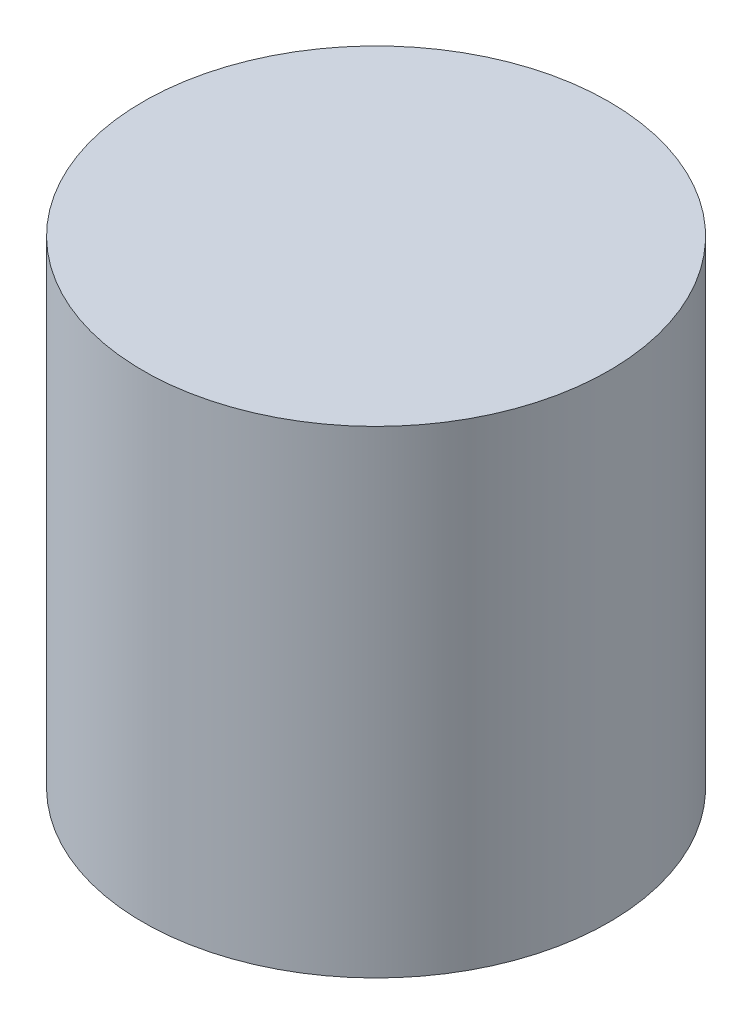
ISO-10303-21;
HEADER;
FILE_DESCRIPTION(('STEP AP214'),'2;1');
FILE_NAME('part.step','',(''),(''),'','','');
FILE_SCHEMA(('AUTOMOTIVE_DESIGN { 1 0 10303 214 1 1 1 1 }'));
ENDSEC;
DATA;
#1=APPLICATION_CONTEXT('core data for automotive mechanical design processes');
#2=APPLICATION_PROTOCOL_DEFINITION('international standard','automotive_design',2000,#1);
#3=PRODUCT_CONTEXT('',#1,'mechanical');
#4=PRODUCT('Part','Part','',(#3));
#5=PRODUCT_RELATED_PRODUCT_CATEGORY('part','',(#4));
#6=PRODUCT_DEFINITION_FORMATION('','',#4);
#7=PRODUCT_DEFINITION_CONTEXT('part definition',#1,'design');
#8=PRODUCT_DEFINITION('design','',#6,#7);
#9=PRODUCT_DEFINITION_SHAPE('','',#8);
#10=(LENGTH_UNIT() NAMED_UNIT(*) SI_UNIT(.MILLI.,.METRE.));
#11=(NAMED_UNIT(*) PLANE_ANGLE_UNIT() SI_UNIT($,.RADIAN.));
#12=(NAMED_UNIT(*) SI_UNIT($,.STERADIAN.) SOLID_ANGLE_UNIT());
#13=UNCERTAINTY_MEASURE_WITH_UNIT(LENGTH_MEASURE(1.E-05),#10,'distance_accuracy_value','');
#14=(GEOMETRIC_REPRESENTATION_CONTEXT(3) GLOBAL_UNCERTAINTY_ASSIGNED_CONTEXT((#13)) GLOBAL_UNIT_ASSIGNED_CONTEXT((#10,
#11,#12)) REPRESENTATION_CONTEXT('',''));
#15=CARTESIAN_POINT('',(0.,0.,0.));
#16=DIRECTION('',(0.,0.,1.));
#17=DIRECTION('',(1.,0.,0.));
#18=AXIS2_PLACEMENT_3D('',#15,#16,#17);
#19=CARTESIAN_POINT('',(0.,410.,0.));
#20=DIRECTION('',(0.,-1.,0.));
#21=DIRECTION('',(0.,0.,-1.));
#22=AXIS2_PLACEMENT_3D('',#19,#20,#21);
#23=CYLINDRICAL_SURFACE('',#22,200.);
#24=CARTESIAN_POINT('',(0.,410.,0.));
#25=DIRECTION('',(0.,1.,0.));
#26=DIRECTION('',(0.,0.,1.));
#27=AXIS2_PLACEMENT_3D('',#24,#25,#26);
#28=CIRCLE('',#27,200.);
#29=CARTESIAN_POINT('',(0.,410.,-200.));
#30=VERTEX_POINT('',#29);
#31=EDGE_CURVE('E10',#30,#30,#28,.T.);
#32=CARTESIAN_POINT('',(0.,0.,0.));
#33=DIRECTION('',(0.,1.,0.));
#34=DIRECTION('',(0.,0.,1.));
#35=AXIS2_PLACEMENT_3D('',#32,#33,#34);
#36=CIRCLE('',#35,200.);
#37=CARTESIAN_POINT('',(0.,0.,-200.));
#38=VERTEX_POINT('',#37);
#39=EDGE_CURVE('E40',#38,#38,#36,.T.);
#40=CARTESIAN_POINT('',(0.,410.,-200.));
#41=CARTESIAN_POINT('',(0.,405.729166666667,-200.));
#42=CARTESIAN_POINT('',(0.,401.458333333333,-200.));
#43=CARTESIAN_POINT('',(0.,392.916666666667,-200.));
#44=CARTESIAN_POINT('',(0.,388.645833333333,-200.));
#45=CARTESIAN_POINT('',(0.,380.104166666667,-200.));
#46=CARTESIAN_POINT('',(0.,375.833333333333,-200.));
#47=CARTESIAN_POINT('',(0.,367.291666666667,-200.));
#48=CARTESIAN_POINT('',(0.,363.020833333333,-200.));
#49=CARTESIAN_POINT('',(0.,354.479166666667,-200.));
#50=CARTESIAN_POINT('',(0.,350.208333333333,-200.));
#51=CARTESIAN_POINT('',(0.,341.666666666667,-200.));
#52=CARTESIAN_POINT('',(0.,337.395833333333,-200.));
#53=CARTESIAN_POINT('',(0.,328.854166666667,-200.));
#54=CARTESIAN_POINT('',(0.,324.583333333333,-200.));
#55=CARTESIAN_POINT('',(0.,316.041666666667,-200.));
#56=CARTESIAN_POINT('',(0.,311.770833333333,-200.));
#57=CARTESIAN_POINT('',(0.,303.229166666667,-200.));
#58=CARTESIAN_POINT('',(0.,298.958333333333,-200.));
#59=CARTESIAN_POINT('',(0.,290.416666666667,-200.));
#60=CARTESIAN_POINT('',(0.,286.145833333333,-200.));
#61=CARTESIAN_POINT('',(0.,277.604166666667,-200.));
#62=CARTESIAN_POINT('',(0.,273.333333333333,-200.));
#63=CARTESIAN_POINT('',(0.,264.791666666667,-200.));
#64=CARTESIAN_POINT('',(0.,260.520833333333,-200.));
#65=CARTESIAN_POINT('',(0.,251.979166666667,-200.));
#66=CARTESIAN_POINT('',(0.,247.708333333333,-200.));
#67=CARTESIAN_POINT('',(0.,239.166666666667,-200.));
#68=CARTESIAN_POINT('',(0.,234.895833333333,-200.));
#69=CARTESIAN_POINT('',(0.,226.354166666667,-200.));
#70=CARTESIAN_POINT('',(0.,222.083333333333,-200.));
#71=CARTESIAN_POINT('',(0.,213.541666666667,-200.));
#72=CARTESIAN_POINT('',(0.,209.270833333333,-200.));
#73=CARTESIAN_POINT('',(0.,200.729166666667,-200.));
#74=CARTESIAN_POINT('',(0.,196.458333333333,-200.));
#75=CARTESIAN_POINT('',(0.,187.916666666667,-200.));
#76=CARTESIAN_POINT('',(0.,183.645833333333,-200.));
#77=CARTESIAN_POINT('',(0.,175.104166666667,-200.));
#78=CARTESIAN_POINT('',(0.,170.833333333333,-200.));
#79=CARTESIAN_POINT('',(0.,162.291666666667,-200.));
#80=CARTESIAN_POINT('',(0.,158.020833333333,-200.));
#81=CARTESIAN_POINT('',(0.,149.479166666667,-200.));
#82=CARTESIAN_POINT('',(0.,145.208333333333,-200.));
#83=CARTESIAN_POINT('',(0.,136.666666666667,-200.));
#84=CARTESIAN_POINT('',(0.,132.395833333333,-200.));
#85=CARTESIAN_POINT('',(0.,123.854166666667,-200.));
#86=CARTESIAN_POINT('',(0.,119.583333333333,-200.));
#87=CARTESIAN_POINT('',(0.,111.041666666667,-200.));
#88=CARTESIAN_POINT('',(0.,106.770833333333,-200.));
#89=CARTESIAN_POINT('',(0.,98.2291666666666,-200.));
#90=CARTESIAN_POINT('',(0.,93.9583333333333,-200.));
#91=CARTESIAN_POINT('',(0.,85.4166666666666,-200.));
#92=CARTESIAN_POINT('',(0.,81.1458333333333,-200.));
#93=CARTESIAN_POINT('',(0.,72.6041666666667,-200.));
#94=CARTESIAN_POINT('',(0.,68.3333333333333,-200.));
#95=CARTESIAN_POINT('',(0.,59.7916666666667,-200.));
#96=CARTESIAN_POINT('',(0.,55.5208333333333,-200.));
#97=CARTESIAN_POINT('',(0.,46.9791666666667,-200.));
#98=CARTESIAN_POINT('',(0.,42.7083333333333,-200.));
#99=CARTESIAN_POINT('',(0.,34.1666666666667,-200.));
#100=CARTESIAN_POINT('',(0.,29.8958333333333,-200.));
#101=CARTESIAN_POINT('',(0.,21.3541666666667,-200.));
#102=CARTESIAN_POINT('',(0.,17.0833333333333,-200.));
#103=CARTESIAN_POINT('',(0.,8.54166666666667,-200.));
#104=CARTESIAN_POINT('',(0.,4.27083333333333,-200.));
#105=CARTESIAN_POINT('',(0.,0.,-200.));
#106=B_SPLINE_CURVE_WITH_KNOTS('',3,(#40,#41,#42,#43,#44,#45,#46,#47,#48,#49,#50,#51,#52,#53,
#54,#55,#56,#57,#58,#59,#60,#61,#62,#63,#64,#65,#66,#67,#68,#69,#70,#71,#72,#73,#74,#75,#76,#77,
#78,#79,#80,#81,#82,#83,#84,#85,#86,#87,#88,#89,#90,#91,#92,#93,#94,#95,#96,#97,#98,#99,#100,
#101,#102,#103,#104,#105),.UNSPECIFIED.,.F.,.F.,(4,2,2,2,2,2,2,2,2,2,2,2,2,2,2,2,2,2,2,2,2,2,2,
2,2,2,2,2,2,2,2,2,4),(0.,12.8124999999999,25.625,38.4375,51.25,64.0625,76.875,89.6874999999999,
102.5,115.3125,128.125,140.9375,153.75,166.5625,179.375,192.1875,205.,217.8125,230.625,243.4375,
256.25,269.0625,281.875,294.6875,307.5,320.3125,333.125,345.9375,358.75,371.5625,384.375,
397.1875,410.),.UNSPECIFIED.);
#107=EDGE_CURVE('BSEAM37',#30,#38,#106,.T.);
#108=ORIENTED_EDGE('',*,*,#31,.F.);
#109=ORIENTED_EDGE('',*,*,#39,.T.);
#110=ORIENTED_EDGE('',*,*,#107,.T.);
#111=ORIENTED_EDGE('',*,*,#107,.F.);
#112=EDGE_LOOP('',(#108,#110,#109,#111));
#113=FACE_BOUND('',#112,.T.);
#114=ADVANCED_FACE('F37',(#113),#23,.T.);
#115=CARTESIAN_POINT('',(0.,410.,0.));
#116=DIRECTION('',(0.,1.,0.));
#117=DIRECTION('',(0.,0.,1.));
#118=AXIS2_PLACEMENT_3D('',#115,#116,#117);
#119=PLANE('',#118);
#120=ORIENTED_EDGE('',*,*,#31,.T.);
#121=EDGE_LOOP('',(#120));
#122=FACE_BOUND('',#121,.T.);
#123=ADVANCED_FACE('F54',(#122),#119,.T.);
#124=CARTESIAN_POINT('',(0.,0.,0.));
#125=DIRECTION('',(0.,1.,0.));
#126=DIRECTION('',(0.,0.,1.));
#127=AXIS2_PLACEMENT_3D('',#124,#125,#126);
#128=PLANE('',#127);
#129=ORIENTED_EDGE('',*,*,#39,.F.);
#130=EDGE_LOOP('',(#129));
#131=FACE_BOUND('',#130,.T.);
#132=ADVANCED_FACE('F52',(#131),#128,.F.);
#133=CLOSED_SHELL('',(#114,#123,#132));
#134=MANIFOLD_SOLID_BREP('B2',#133);
#135=ADVANCED_BREP_SHAPE_REPRESENTATION('',(#18,#134),#14);
#136=SHAPE_DEFINITION_REPRESENTATION(#9,#135);
ENDSEC;
END-ISO-10303-21;
